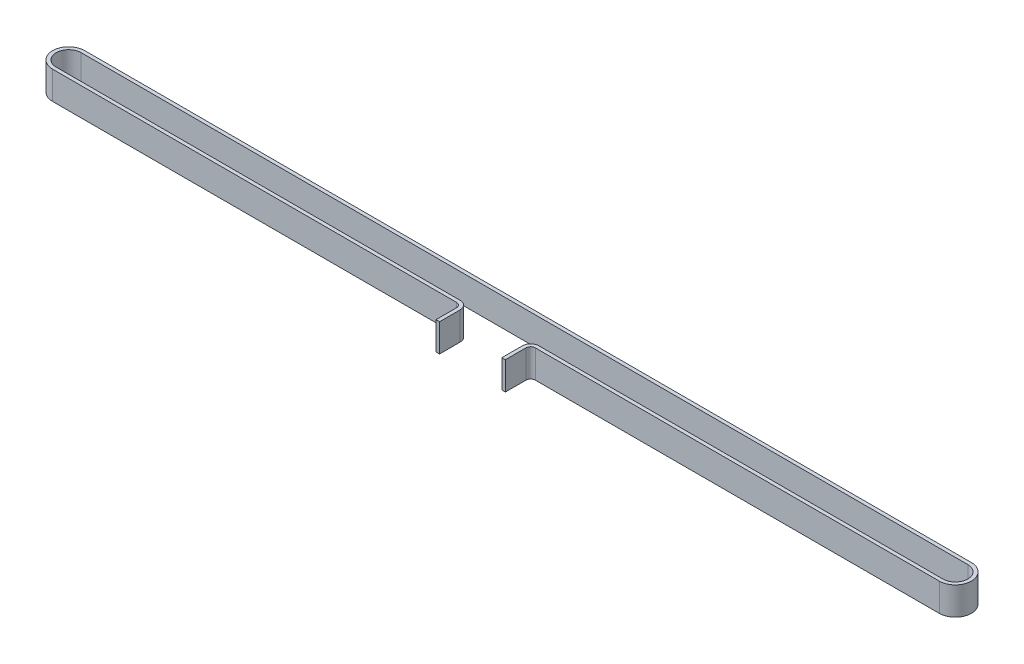
ISO-10303-21;
HEADER;
FILE_DESCRIPTION(('STEP AP214'),'2;1');
FILE_NAME('part.step','',(''),(''),'','','');
FILE_SCHEMA(('AUTOMOTIVE_DESIGN { 1 0 10303 214 1 1 1 1 }'));
ENDSEC;
DATA;
#1=APPLICATION_CONTEXT('core data for automotive mechanical design processes');
#2=APPLICATION_PROTOCOL_DEFINITION('international standard','automotive_design',2000,#1);
#3=PRODUCT_CONTEXT('',#1,'mechanical');
#4=PRODUCT('Part','Part','',(#3));
#5=PRODUCT_RELATED_PRODUCT_CATEGORY('part','',(#4));
#6=PRODUCT_DEFINITION_FORMATION('','',#4);
#7=PRODUCT_DEFINITION_CONTEXT('part definition',#1,'design');
#8=PRODUCT_DEFINITION('design','',#6,#7);
#9=PRODUCT_DEFINITION_SHAPE('','',#8);
#10=(LENGTH_UNIT() NAMED_UNIT(*) SI_UNIT(.MILLI.,.METRE.));
#11=(NAMED_UNIT(*) PLANE_ANGLE_UNIT() SI_UNIT($,.RADIAN.));
#12=(NAMED_UNIT(*) SI_UNIT($,.STERADIAN.) SOLID_ANGLE_UNIT());
#13=UNCERTAINTY_MEASURE_WITH_UNIT(LENGTH_MEASURE(1.E-05),#10,'distance_accuracy_value','');
#14=(GEOMETRIC_REPRESENTATION_CONTEXT(3) GLOBAL_UNCERTAINTY_ASSIGNED_CONTEXT((#13)) GLOBAL_UNIT_ASSIGNED_CONTEXT((#10,
#11,#12)) REPRESENTATION_CONTEXT('',''));
#15=CARTESIAN_POINT('',(0.,0.,0.));
#16=DIRECTION('',(0.,0.,1.));
#17=DIRECTION('',(1.,0.,0.));
#18=AXIS2_PLACEMENT_3D('',#15,#16,#17);
#19=CARTESIAN_POINT('',(203.352965498256,12.,8.881));
#20=DIRECTION('',(1.,0.,0.));
#21=DIRECTION('',(0.,0.,-1.));
#22=AXIS2_PLACEMENT_3D('',#19,#20,#21);
#23=PLANE('',#22);
#24=DIRECTION('',(0.,0.,-1.));
#25=VECTOR('',#24,1.);
#26=CARTESIAN_POINT('',(203.352965498256,0.,8.881));
#27=LINE('',#26,#25);
#28=CARTESIAN_POINT('',(203.352965498256,0.,8.881));
#29=VERTEX_POINT('',#28);
#30=CARTESIAN_POINT('',(203.352965498256,0.,17.7005415216234));
#31=VERTEX_POINT('',#30);
#32=EDGE_CURVE('E206',#29,#31,#27,.F.);
#33=ORIENTED_EDGE('',*,*,#32,.T.);
#34=DIRECTION('',(0.,-1.,0.));
#35=VECTOR('',#34,1.);
#36=CARTESIAN_POINT('',(203.352965498256,12.,17.7005415216234));
#37=LINE('',#36,#35);
#38=CARTESIAN_POINT('',(203.352965498256,12.,17.7005415216234));
#39=VERTEX_POINT('',#38);
#40=EDGE_CURVE('E11',#39,#31,#37,.T.);
#41=ORIENTED_EDGE('',*,*,#40,.F.);
#42=DIRECTION('',(0.,0.,-1.));
#43=VECTOR('',#42,1.);
#44=CARTESIAN_POINT('',(203.352965498256,12.,8.881));
#45=LINE('',#44,#43);
#46=CARTESIAN_POINT('',(203.352965498256,12.,8.881));
#47=VERTEX_POINT('',#46);
#48=EDGE_CURVE('E131',#47,#39,#45,.F.);
#49=ORIENTED_EDGE('',*,*,#48,.F.);
#50=DIRECTION('',(0.,-1.,0.));
#51=VECTOR('',#50,1.);
#52=CARTESIAN_POINT('',(203.352965498256,12.,8.881));
#53=LINE('',#52,#51);
#54=EDGE_CURVE('E202',#47,#29,#53,.T.);
#55=ORIENTED_EDGE('',*,*,#54,.T.);
#56=EDGE_LOOP('',(#33,#41,#49,#55));
#57=FACE_BOUND('',#56,.T.);
#58=ADVANCED_FACE('F39',(#57),#23,.F.);
#59=CARTESIAN_POINT('',(204.872965498256,12.,17.7005415216234));
#60=DIRECTION('',(0.,0.,1.));
#61=DIRECTION('',(1.,0.,0.));
#62=AXIS2_PLACEMENT_3D('',#59,#60,#61);
#63=PLANE('',#62);
#64=DIRECTION('',(-1.,0.,0.));
#65=VECTOR('',#64,1.);
#66=CARTESIAN_POINT('',(204.872965498256,0.,17.7005415216234));
#67=LINE('',#66,#65);
#68=CARTESIAN_POINT('',(204.872965498256,0.,17.7005415216234));
#69=VERTEX_POINT('',#68);
#70=EDGE_CURVE('E209',#69,#31,#67,.T.);
#71=ORIENTED_EDGE('',*,*,#70,.F.);
#72=DIRECTION('',(0.,-1.,0.));
#73=VECTOR('',#72,1.);
#74=CARTESIAN_POINT('',(204.872965498256,12.,17.7005415216234));
#75=LINE('',#74,#73);
#76=CARTESIAN_POINT('',(204.872965498256,12.,17.7005415216234));
#77=VERTEX_POINT('',#76);
#78=EDGE_CURVE('E47',#77,#69,#75,.T.);
#79=ORIENTED_EDGE('',*,*,#78,.F.);
#80=DIRECTION('',(-1.,0.,0.));
#81=VECTOR('',#80,1.);
#82=CARTESIAN_POINT('',(204.872965498256,12.,17.7005415216234));
#83=LINE('',#82,#81);
#84=EDGE_CURVE('E311',#77,#39,#83,.T.);
#85=ORIENTED_EDGE('',*,*,#84,.T.);
#86=ORIENTED_EDGE('',*,*,#40,.T.);
#87=EDGE_LOOP('',(#71,#79,#85,#86));
#88=FACE_BOUND('',#87,.T.);
#89=ADVANCED_FACE('F298',(#88),#63,.T.);
#90=CARTESIAN_POINT('',(204.872965498256,12.,8.881));
#91=DIRECTION('',(1.,0.,0.));
#92=DIRECTION('',(0.,0.,-1.));
#93=AXIS2_PLACEMENT_3D('',#90,#91,#92);
#94=PLANE('',#93);
#95=DIRECTION('',(0.,0.,-1.));
#96=VECTOR('',#95,1.);
#97=CARTESIAN_POINT('',(204.872965498256,0.,8.881));
#98=LINE('',#97,#96);
#99=CARTESIAN_POINT('',(204.872965498256,0.,8.881));
#100=VERTEX_POINT('',#99);
#101=EDGE_CURVE('E212',#100,#69,#98,.F.);
#102=ORIENTED_EDGE('',*,*,#101,.F.);
#103=DIRECTION('',(0.,-1.,0.));
#104=VECTOR('',#103,1.);
#105=CARTESIAN_POINT('',(204.872965498256,12.,8.881));
#106=LINE('',#105,#104);
#107=CARTESIAN_POINT('',(204.872965498256,12.,8.881));
#108=VERTEX_POINT('',#107);
#109=EDGE_CURVE('E288',#108,#100,#106,.T.);
#110=ORIENTED_EDGE('',*,*,#109,.F.);
#111=DIRECTION('',(0.,0.,-1.));
#112=VECTOR('',#111,1.);
#113=CARTESIAN_POINT('',(204.872965498256,12.,8.881));
#114=LINE('',#113,#112);
#115=EDGE_CURVE('E295',#108,#77,#114,.F.);
#116=ORIENTED_EDGE('',*,*,#115,.T.);
#117=ORIENTED_EDGE('',*,*,#78,.T.);
#118=EDGE_LOOP('',(#102,#110,#116,#117));
#119=FACE_BOUND('',#118,.T.);
#120=ADVANCED_FACE('F293',(#119),#94,.T.);
#121=CARTESIAN_POINT('',(206.872965498256,12.,8.88100000000002));
#122=DIRECTION('',(0.,-1.,0.));
#123=DIRECTION('',(0.,0.,-1.));
#124=AXIS2_PLACEMENT_3D('',#121,#122,#123);
#125=CYLINDRICAL_SURFACE('',#124,2.00000000000001);
#126=CARTESIAN_POINT('',(206.872965498256,0.,8.88100000000002));
#127=DIRECTION('',(0.,1.,0.));
#128=DIRECTION('',(1.,0.,0.));
#129=AXIS2_PLACEMENT_3D('',#126,#127,#128);
#130=CIRCLE('',#129,2.00000000000001);
#131=CARTESIAN_POINT('',(206.872965498256,0.,6.88100000000001));
#132=VERTEX_POINT('',#131);
#133=EDGE_CURVE('E215',#132,#100,#130,.T.);
#134=ORIENTED_EDGE('',*,*,#133,.F.);
#135=DIRECTION('',(0.,-1.,0.));
#136=VECTOR('',#135,1.);
#137=CARTESIAN_POINT('',(206.872965498256,12.,6.88100000000001));
#138=LINE('',#137,#136);
#139=CARTESIAN_POINT('',(206.872965498256,12.,6.88100000000001));
#140=VERTEX_POINT('',#139);
#141=EDGE_CURVE('E286',#140,#132,#138,.T.);
#142=ORIENTED_EDGE('',*,*,#141,.F.);
#143=CARTESIAN_POINT('',(206.872965498256,12.,8.88100000000002));
#144=DIRECTION('',(0.,1.,0.));
#145=DIRECTION('',(1.,0.,0.));
#146=AXIS2_PLACEMENT_3D('',#143,#144,#145);
#147=CIRCLE('',#146,2.00000000000001);
#148=EDGE_CURVE('E308',#140,#108,#147,.T.);
#149=ORIENTED_EDGE('',*,*,#148,.T.);
#150=ORIENTED_EDGE('',*,*,#109,.T.);
#151=EDGE_LOOP('',(#134,#142,#149,#150));
#152=FACE_BOUND('',#151,.T.);
#153=ADVANCED_FACE('F305',(#152),#125,.F.);
#154=CARTESIAN_POINT('',(380.,12.,6.881));
#155=DIRECTION('',(0.,0.,1.));
#156=DIRECTION('',(1.,0.,0.));
#157=AXIS2_PLACEMENT_3D('',#154,#155,#156);
#158=PLANE('',#157);
#159=DIRECTION('',(-1.,0.,0.));
#160=VECTOR('',#159,1.);
#161=CARTESIAN_POINT('',(380.,0.,6.881));
#162=LINE('',#161,#160);
#163=CARTESIAN_POINT('',(380.,0.,6.881));
#164=VERTEX_POINT('',#163);
#165=EDGE_CURVE('E218',#164,#132,#162,.T.);
#166=ORIENTED_EDGE('',*,*,#165,.F.);
#167=DIRECTION('',(0.,-1.,0.));
#168=VECTOR('',#167,1.);
#169=CARTESIAN_POINT('',(380.,12.,6.881));
#170=LINE('',#169,#168);
#171=CARTESIAN_POINT('',(380.,12.,6.881));
#172=VERTEX_POINT('',#171);
#173=EDGE_CURVE('E284',#172,#164,#170,.T.);
#174=ORIENTED_EDGE('',*,*,#173,.F.);
#175=DIRECTION('',(-1.,0.,0.));
#176=VECTOR('',#175,1.);
#177=CARTESIAN_POINT('',(380.,12.,6.881));
#178=LINE('',#177,#176);
#179=EDGE_CURVE('E313',#172,#140,#178,.T.);
#180=ORIENTED_EDGE('',*,*,#179,.T.);
#181=ORIENTED_EDGE('',*,*,#141,.T.);
#182=EDGE_LOOP('',(#166,#174,#180,#181));
#183=FACE_BOUND('',#182,.T.);
#184=ADVANCED_FACE('F379',(#183),#158,.T.);
#185=CARTESIAN_POINT('',(380.,12.,0.));
#186=DIRECTION('',(0.,-1.,0.));
#187=DIRECTION('',(0.,0.,-1.));
#188=AXIS2_PLACEMENT_3D('',#185,#186,#187);
#189=CYLINDRICAL_SURFACE('',#188,6.881);
#190=CARTESIAN_POINT('',(380.,0.,0.));
#191=DIRECTION('',(0.,1.,0.));
#192=DIRECTION('',(1.,0.,0.));
#193=AXIS2_PLACEMENT_3D('',#190,#191,#192);
#194=CIRCLE('',#193,6.881);
#195=CARTESIAN_POINT('',(380.,0.,-6.881));
#196=VERTEX_POINT('',#195);
#197=EDGE_CURVE('E221',#196,#164,#194,.F.);
#198=ORIENTED_EDGE('',*,*,#197,.F.);
#199=DIRECTION('',(0.,-1.,0.));
#200=VECTOR('',#199,1.);
#201=CARTESIAN_POINT('',(380.,12.,-6.881));
#202=LINE('',#201,#200);
#203=CARTESIAN_POINT('',(380.,12.,-6.881));
#204=VERTEX_POINT('',#203);
#205=EDGE_CURVE('E282',#204,#196,#202,.T.);
#206=ORIENTED_EDGE('',*,*,#205,.F.);
#207=CARTESIAN_POINT('',(380.,12.,0.));
#208=DIRECTION('',(0.,1.,0.));
#209=DIRECTION('',(1.,0.,0.));
#210=AXIS2_PLACEMENT_3D('',#207,#208,#209);
#211=CIRCLE('',#210,6.881);
#212=EDGE_CURVE('E319',#204,#172,#211,.F.);
#213=ORIENTED_EDGE('',*,*,#212,.T.);
#214=ORIENTED_EDGE('',*,*,#173,.T.);
#215=EDGE_LOOP('',(#198,#206,#213,#214));
#216=FACE_BOUND('',#215,.T.);
#217=ADVANCED_FACE('F382',(#216),#189,.T.);
#218=CARTESIAN_POINT('',(0.,12.,-6.881));
#219=DIRECTION('',(0.,0.,-1.));
#220=DIRECTION('',(-1.,0.,0.));
#221=AXIS2_PLACEMENT_3D('',#218,#219,#220);
#222=PLANE('',#221);
#223=DIRECTION('',(1.,0.,0.));
#224=VECTOR('',#223,1.);
#225=CARTESIAN_POINT('',(0.,0.,-6.881));
#226=LINE('',#225,#224);
#227=CARTESIAN_POINT('',(0.,0.,-6.881));
#228=VERTEX_POINT('',#227);
#229=EDGE_CURVE('E224',#228,#196,#226,.T.);
#230=ORIENTED_EDGE('',*,*,#229,.F.);
#231=DIRECTION('',(0.,-1.,0.));
#232=VECTOR('',#231,1.);
#233=CARTESIAN_POINT('',(0.,12.,-6.881));
#234=LINE('',#233,#232);
#235=CARTESIAN_POINT('',(0.,12.,-6.881));
#236=VERTEX_POINT('',#235);
#237=EDGE_CURVE('E280',#236,#228,#234,.T.);
#238=ORIENTED_EDGE('',*,*,#237,.F.);
#239=DIRECTION('',(1.,0.,0.));
#240=VECTOR('',#239,1.);
#241=CARTESIAN_POINT('',(0.,12.,-6.881));
#242=LINE('',#241,#240);
#243=EDGE_CURVE('E322',#236,#204,#242,.T.);
#244=ORIENTED_EDGE('',*,*,#243,.T.);
#245=ORIENTED_EDGE('',*,*,#205,.T.);
#246=EDGE_LOOP('',(#230,#238,#244,#245));
#247=FACE_BOUND('',#246,.T.);
#248=ADVANCED_FACE('F386',(#247),#222,.T.);
#249=CARTESIAN_POINT('',(0.,12.,0.));
#250=DIRECTION('',(0.,-1.,0.));
#251=DIRECTION('',(0.,0.,-1.));
#252=AXIS2_PLACEMENT_3D('',#249,#250,#251);
#253=CYLINDRICAL_SURFACE('',#252,6.881);
#254=CARTESIAN_POINT('',(0.,0.,0.));
#255=DIRECTION('',(0.,1.,0.));
#256=DIRECTION('',(1.,0.,0.));
#257=AXIS2_PLACEMENT_3D('',#254,#255,#256);
#258=CIRCLE('',#257,6.881);
#259=CARTESIAN_POINT('',(0.,0.,6.881));
#260=VERTEX_POINT('',#259);
#261=EDGE_CURVE('E227',#260,#228,#258,.F.);
#262=ORIENTED_EDGE('',*,*,#261,.F.);
#263=DIRECTION('',(0.,-1.,0.));
#264=VECTOR('',#263,1.);
#265=CARTESIAN_POINT('',(0.,12.,6.881));
#266=LINE('',#265,#264);
#267=CARTESIAN_POINT('',(0.,12.,6.881));
#268=VERTEX_POINT('',#267);
#269=EDGE_CURVE('E278',#268,#260,#266,.T.);
#270=ORIENTED_EDGE('',*,*,#269,.F.);
#271=CARTESIAN_POINT('',(0.,12.,0.));
#272=DIRECTION('',(0.,1.,0.));
#273=DIRECTION('',(1.,0.,0.));
#274=AXIS2_PLACEMENT_3D('',#271,#272,#273);
#275=CIRCLE('',#274,6.881);
#276=EDGE_CURVE('E325',#268,#236,#275,.F.);
#277=ORIENTED_EDGE('',*,*,#276,.T.);
#278=ORIENTED_EDGE('',*,*,#237,.T.);
#279=EDGE_LOOP('',(#262,#270,#277,#278));
#280=FACE_BOUND('',#279,.T.);
#281=ADVANCED_FACE('F390',(#280),#253,.T.);
#282=CARTESIAN_POINT('',(0.,12.,6.881));
#283=DIRECTION('',(0.,0.,1.));
#284=DIRECTION('',(1.,0.,0.));
#285=AXIS2_PLACEMENT_3D('',#282,#283,#284);
#286=PLANE('',#285);
#287=DIRECTION('',(1.,0.,0.));
#288=VECTOR('',#287,1.);
#289=CARTESIAN_POINT('',(0.,0.,6.881));
#290=LINE('',#289,#288);
#291=CARTESIAN_POINT('',(173.127034501744,0.,6.881));
#292=VERTEX_POINT('',#291);
#293=EDGE_CURVE('E230',#292,#260,#290,.F.);
#294=ORIENTED_EDGE('',*,*,#293,.F.);
#295=DIRECTION('',(0.,-1.,0.));
#296=VECTOR('',#295,1.);
#297=CARTESIAN_POINT('',(173.127034501744,12.,6.881));
#298=LINE('',#297,#296);
#299=CARTESIAN_POINT('',(173.127034501744,12.,6.881));
#300=VERTEX_POINT('',#299);
#301=EDGE_CURVE('E276',#300,#292,#298,.T.);
#302=ORIENTED_EDGE('',*,*,#301,.F.);
#303=DIRECTION('',(1.,0.,0.));
#304=VECTOR('',#303,1.);
#305=CARTESIAN_POINT('',(0.,12.,6.881));
#306=LINE('',#305,#304);
#307=EDGE_CURVE('E328',#300,#268,#306,.F.);
#308=ORIENTED_EDGE('',*,*,#307,.T.);
#309=ORIENTED_EDGE('',*,*,#269,.T.);
#310=EDGE_LOOP('',(#294,#302,#308,#309));
#311=FACE_BOUND('',#310,.T.);
#312=ADVANCED_FACE('F394',(#311),#286,.T.);
#313=CARTESIAN_POINT('',(173.127034501744,12.,8.881));
#314=DIRECTION('',(0.,-1.,0.));
#315=DIRECTION('',(0.,0.,-1.));
#316=AXIS2_PLACEMENT_3D('',#313,#314,#315);
#317=CYLINDRICAL_SURFACE('',#316,2.);
#318=CARTESIAN_POINT('',(173.127034501744,0.,8.881));
#319=DIRECTION('',(0.,1.,0.));
#320=DIRECTION('',(1.,0.,0.));
#321=AXIS2_PLACEMENT_3D('',#318,#319,#320);
#322=CIRCLE('',#321,2.);
#323=CARTESIAN_POINT('',(175.127034501744,0.,8.881));
#324=VERTEX_POINT('',#323);
#325=EDGE_CURVE('E233',#324,#292,#322,.T.);
#326=ORIENTED_EDGE('',*,*,#325,.F.);
#327=DIRECTION('',(0.,-1.,0.));
#328=VECTOR('',#327,1.);
#329=CARTESIAN_POINT('',(175.127034501744,12.,8.881));
#330=LINE('',#329,#328);
#331=CARTESIAN_POINT('',(175.127034501744,12.,8.881));
#332=VERTEX_POINT('',#331);
#333=EDGE_CURVE('E274',#332,#324,#330,.T.);
#334=ORIENTED_EDGE('',*,*,#333,.F.);
#335=CARTESIAN_POINT('',(173.127034501744,12.,8.881));
#336=DIRECTION('',(0.,1.,0.));
#337=DIRECTION('',(1.,0.,0.));
#338=AXIS2_PLACEMENT_3D('',#335,#336,#337);
#339=CIRCLE('',#338,2.);
#340=EDGE_CURVE('E331',#332,#300,#339,.T.);
#341=ORIENTED_EDGE('',*,*,#340,.T.);
#342=ORIENTED_EDGE('',*,*,#301,.T.);
#343=EDGE_LOOP('',(#326,#334,#341,#342));
#344=FACE_BOUND('',#343,.T.);
#345=ADVANCED_FACE('F398',(#344),#317,.F.);
#346=CARTESIAN_POINT('',(175.127034501744,12.,8.881));
#347=DIRECTION('',(-1.,0.,0.));
#348=DIRECTION('',(0.,0.,1.));
#349=AXIS2_PLACEMENT_3D('',#346,#347,#348);
#350=PLANE('',#349);
#351=DIRECTION('',(0.,0.,-1.));
#352=VECTOR('',#351,1.);
#353=CARTESIAN_POINT('',(175.127034501744,0.,8.881));
#354=LINE('',#353,#352);
#355=CARTESIAN_POINT('',(175.127034501744,0.,17.7005415216234));
#356=VERTEX_POINT('',#355);
#357=EDGE_CURVE('E236',#356,#324,#354,.T.);
#358=ORIENTED_EDGE('',*,*,#357,.F.);
#359=DIRECTION('',(0.,-1.,0.));
#360=VECTOR('',#359,1.);
#361=CARTESIAN_POINT('',(175.127034501744,12.,17.7005415216234));
#362=LINE('',#361,#360);
#363=CARTESIAN_POINT('',(175.127034501744,12.,17.7005415216234));
#364=VERTEX_POINT('',#363);
#365=EDGE_CURVE('E272',#364,#356,#362,.T.);
#366=ORIENTED_EDGE('',*,*,#365,.F.);
#367=DIRECTION('',(0.,0.,-1.));
#368=VECTOR('',#367,1.);
#369=CARTESIAN_POINT('',(175.127034501744,12.,8.881));
#370=LINE('',#369,#368);
#371=EDGE_CURVE('E334',#364,#332,#370,.T.);
#372=ORIENTED_EDGE('',*,*,#371,.T.);
#373=ORIENTED_EDGE('',*,*,#333,.T.);
#374=EDGE_LOOP('',(#358,#366,#372,#373));
#375=FACE_BOUND('',#374,.T.);
#376=ADVANCED_FACE('F402',(#375),#350,.T.);
#377=CARTESIAN_POINT('',(176.647034501744,12.,17.7005415216234));
#378=DIRECTION('',(0.,0.,1.));
#379=DIRECTION('',(1.,0.,0.));
#380=AXIS2_PLACEMENT_3D('',#377,#378,#379);
#381=PLANE('',#380);
#382=DIRECTION('',(-1.,0.,0.));
#383=VECTOR('',#382,1.);
#384=CARTESIAN_POINT('',(176.647034501744,0.,17.7005415216234));
#385=LINE('',#384,#383);
#386=CARTESIAN_POINT('',(176.647034501744,0.,17.7005415216234));
#387=VERTEX_POINT('',#386);
#388=EDGE_CURVE('E239',#387,#356,#385,.T.);
#389=ORIENTED_EDGE('',*,*,#388,.F.);
#390=DIRECTION('',(0.,-1.,0.));
#391=VECTOR('',#390,1.);
#392=CARTESIAN_POINT('',(176.647034501744,12.,17.7005415216234));
#393=LINE('',#392,#391);
#394=CARTESIAN_POINT('',(176.647034501744,12.,17.7005415216234));
#395=VERTEX_POINT('',#394);
#396=EDGE_CURVE('E270',#395,#387,#393,.T.);
#397=ORIENTED_EDGE('',*,*,#396,.F.);
#398=DIRECTION('',(-1.,0.,0.));
#399=VECTOR('',#398,1.);
#400=CARTESIAN_POINT('',(176.647034501744,12.,17.7005415216234));
#401=LINE('',#400,#399);
#402=EDGE_CURVE('E337',#395,#364,#401,.T.);
#403=ORIENTED_EDGE('',*,*,#402,.T.);
#404=ORIENTED_EDGE('',*,*,#365,.T.);
#405=EDGE_LOOP('',(#389,#397,#403,#404));
#406=FACE_BOUND('',#405,.T.);
#407=ADVANCED_FACE('F406',(#406),#381,.T.);
#408=CARTESIAN_POINT('',(176.647034501744,12.,8.881));
#409=DIRECTION('',(-1.,0.,0.));
#410=DIRECTION('',(0.,0.,1.));
#411=AXIS2_PLACEMENT_3D('',#408,#409,#410);
#412=PLANE('',#411);
#413=DIRECTION('',(0.,0.,-1.));
#414=VECTOR('',#413,1.);
#415=CARTESIAN_POINT('',(176.647034501744,0.,8.881));
#416=LINE('',#415,#414);
#417=CARTESIAN_POINT('',(176.647034501744,0.,8.881));
#418=VERTEX_POINT('',#417);
#419=EDGE_CURVE('E242',#387,#418,#416,.T.);
#420=ORIENTED_EDGE('',*,*,#419,.T.);
#421=DIRECTION('',(0.,-1.,0.));
#422=VECTOR('',#421,1.);
#423=CARTESIAN_POINT('',(176.647034501744,12.,8.881));
#424=LINE('',#423,#422);
#425=CARTESIAN_POINT('',(176.647034501744,12.,8.881));
#426=VERTEX_POINT('',#425);
#427=EDGE_CURVE('E267',#426,#418,#424,.T.);
#428=ORIENTED_EDGE('',*,*,#427,.F.);
#429=DIRECTION('',(0.,0.,-1.));
#430=VECTOR('',#429,1.);
#431=CARTESIAN_POINT('',(176.647034501744,12.,8.881));
#432=LINE('',#431,#430);
#433=EDGE_CURVE('E340',#395,#426,#432,.T.);
#434=ORIENTED_EDGE('',*,*,#433,.F.);
#435=ORIENTED_EDGE('',*,*,#396,.T.);
#436=EDGE_LOOP('',(#420,#428,#434,#435));
#437=FACE_BOUND('',#436,.T.);
#438=ADVANCED_FACE('F410',(#437),#412,.F.);
#439=CARTESIAN_POINT('',(173.127034501744,12.,8.881));
#440=DIRECTION('',(0.,-1.,0.));
#441=DIRECTION('',(0.,0.,-1.));
#442=AXIS2_PLACEMENT_3D('',#439,#440,#441);
#443=CYLINDRICAL_SURFACE('',#442,3.52);
#444=CARTESIAN_POINT('',(173.127034501744,0.,8.881));
#445=DIRECTION('',(0.,1.,0.));
#446=DIRECTION('',(1.,0.,0.));
#447=AXIS2_PLACEMENT_3D('',#444,#445,#446);
#448=CIRCLE('',#447,3.52);
#449=CARTESIAN_POINT('',(173.127034501744,0.,5.361));
#450=VERTEX_POINT('',#449);
#451=EDGE_CURVE('E244',#418,#450,#448,.T.);
#452=ORIENTED_EDGE('',*,*,#451,.T.);
#453=DIRECTION('',(0.,-1.,0.));
#454=VECTOR('',#453,1.);
#455=CARTESIAN_POINT('',(173.127034501744,12.,5.361));
#456=LINE('',#455,#454);
#457=CARTESIAN_POINT('',(173.127034501744,12.,5.361));
#458=VERTEX_POINT('',#457);
#459=EDGE_CURVE('E264',#458,#450,#456,.T.);
#460=ORIENTED_EDGE('',*,*,#459,.F.);
#461=CARTESIAN_POINT('',(173.127034501744,12.,8.881));
#462=DIRECTION('',(0.,1.,0.));
#463=DIRECTION('',(1.,0.,0.));
#464=AXIS2_PLACEMENT_3D('',#461,#462,#463);
#465=CIRCLE('',#464,3.52);
#466=EDGE_CURVE('E342',#426,#458,#465,.T.);
#467=ORIENTED_EDGE('',*,*,#466,.F.);
#468=ORIENTED_EDGE('',*,*,#427,.T.);
#469=EDGE_LOOP('',(#452,#460,#467,#468));
#470=FACE_BOUND('',#469,.T.);
#471=ADVANCED_FACE('F414',(#470),#443,.T.);
#472=CARTESIAN_POINT('',(0.,12.,5.361));
#473=DIRECTION('',(0.,0.,1.));
#474=DIRECTION('',(1.,0.,0.));
#475=AXIS2_PLACEMENT_3D('',#472,#473,#474);
#476=PLANE('',#475);
#477=DIRECTION('',(1.,0.,0.));
#478=VECTOR('',#477,1.);
#479=CARTESIAN_POINT('',(0.,0.,5.361));
#480=LINE('',#479,#478);
#481=CARTESIAN_POINT('',(0.,0.,5.361));
#482=VERTEX_POINT('',#481);
#483=EDGE_CURVE('E246',#450,#482,#480,.F.);
#484=ORIENTED_EDGE('',*,*,#483,.T.);
#485=DIRECTION('',(0.,-1.,0.));
#486=VECTOR('',#485,1.);
#487=CARTESIAN_POINT('',(0.,12.,5.361));
#488=LINE('',#487,#486);
#489=CARTESIAN_POINT('',(0.,12.,5.361));
#490=VERTEX_POINT('',#489);
#491=EDGE_CURVE('E261',#490,#482,#488,.T.);
#492=ORIENTED_EDGE('',*,*,#491,.F.);
#493=DIRECTION('',(1.,0.,0.));
#494=VECTOR('',#493,1.);
#495=CARTESIAN_POINT('',(0.,12.,5.361));
#496=LINE('',#495,#494);
#497=EDGE_CURVE('E344',#458,#490,#496,.F.);
#498=ORIENTED_EDGE('',*,*,#497,.F.);
#499=ORIENTED_EDGE('',*,*,#459,.T.);
#500=EDGE_LOOP('',(#484,#492,#498,#499));
#501=FACE_BOUND('',#500,.T.);
#502=ADVANCED_FACE('F418',(#501),#476,.F.);
#503=CARTESIAN_POINT('',(0.,12.,0.));
#504=DIRECTION('',(0.,-1.,0.));
#505=DIRECTION('',(0.,0.,-1.));
#506=AXIS2_PLACEMENT_3D('',#503,#504,#505);
#507=CYLINDRICAL_SURFACE('',#506,5.361);
#508=CARTESIAN_POINT('',(0.,0.,0.));
#509=DIRECTION('',(0.,1.,0.));
#510=DIRECTION('',(1.,0.,0.));
#511=AXIS2_PLACEMENT_3D('',#508,#509,#510);
#512=CIRCLE('',#511,5.361);
#513=CARTESIAN_POINT('',(0.,0.,-5.361));
#514=VERTEX_POINT('',#513);
#515=EDGE_CURVE('E248',#482,#514,#512,.F.);
#516=ORIENTED_EDGE('',*,*,#515,.T.);
#517=DIRECTION('',(0.,-1.,0.));
#518=VECTOR('',#517,1.);
#519=CARTESIAN_POINT('',(0.,12.,-5.361));
#520=LINE('',#519,#518);
#521=CARTESIAN_POINT('',(0.,12.,-5.361));
#522=VERTEX_POINT('',#521);
#523=EDGE_CURVE('E258',#522,#514,#520,.T.);
#524=ORIENTED_EDGE('',*,*,#523,.F.);
#525=CARTESIAN_POINT('',(0.,12.,0.));
#526=DIRECTION('',(0.,1.,0.));
#527=DIRECTION('',(1.,0.,0.));
#528=AXIS2_PLACEMENT_3D('',#525,#526,#527);
#529=CIRCLE('',#528,5.361);
#530=EDGE_CURVE('E346',#490,#522,#529,.F.);
#531=ORIENTED_EDGE('',*,*,#530,.F.);
#532=ORIENTED_EDGE('',*,*,#491,.T.);
#533=EDGE_LOOP('',(#516,#524,#531,#532));
#534=FACE_BOUND('',#533,.T.);
#535=ADVANCED_FACE('F352',(#534),#507,.F.);
#536=CARTESIAN_POINT('',(0.,12.,-5.361));
#537=DIRECTION('',(0.,0.,-1.));
#538=DIRECTION('',(-1.,0.,0.));
#539=AXIS2_PLACEMENT_3D('',#536,#537,#538);
#540=PLANE('',#539);
#541=DIRECTION('',(1.,0.,0.));
#542=VECTOR('',#541,1.);
#543=CARTESIAN_POINT('',(0.,0.,-5.361));
#544=LINE('',#543,#542);
#545=CARTESIAN_POINT('',(380.,0.,-5.361));
#546=VERTEX_POINT('',#545);
#547=EDGE_CURVE('E250',#514,#546,#544,.T.);
#548=ORIENTED_EDGE('',*,*,#547,.T.);
#549=DIRECTION('',(0.,-1.,0.));
#550=VECTOR('',#549,1.);
#551=CARTESIAN_POINT('',(380.,12.,-5.361));
#552=LINE('',#551,#550);
#553=CARTESIAN_POINT('',(380.,12.,-5.361));
#554=VERTEX_POINT('',#553);
#555=EDGE_CURVE('E197',#554,#546,#552,.T.);
#556=ORIENTED_EDGE('',*,*,#555,.F.);
#557=DIRECTION('',(1.,0.,0.));
#558=VECTOR('',#557,1.);
#559=CARTESIAN_POINT('',(0.,12.,-5.361));
#560=LINE('',#559,#558);
#561=EDGE_CURVE('E188',#522,#554,#560,.T.);
#562=ORIENTED_EDGE('',*,*,#561,.F.);
#563=ORIENTED_EDGE('',*,*,#523,.T.);
#564=EDGE_LOOP('',(#548,#556,#562,#563));
#565=FACE_BOUND('',#564,.T.);
#566=ADVANCED_FACE('F356',(#565),#540,.F.);
#567=CARTESIAN_POINT('',(380.,12.,0.));
#568=DIRECTION('',(0.,-1.,0.));
#569=DIRECTION('',(0.,0.,-1.));
#570=AXIS2_PLACEMENT_3D('',#567,#568,#569);
#571=CYLINDRICAL_SURFACE('',#570,5.361);
#572=CARTESIAN_POINT('',(380.,0.,0.));
#573=DIRECTION('',(0.,1.,0.));
#574=DIRECTION('',(1.,0.,0.));
#575=AXIS2_PLACEMENT_3D('',#572,#573,#574);
#576=CIRCLE('',#575,5.361);
#577=CARTESIAN_POINT('',(380.,0.,5.361));
#578=VERTEX_POINT('',#577);
#579=EDGE_CURVE('E196',#546,#578,#576,.F.);
#580=ORIENTED_EDGE('',*,*,#579,.T.);
#581=DIRECTION('',(0.,-1.,0.));
#582=VECTOR('',#581,1.);
#583=CARTESIAN_POINT('',(380.,12.,5.361));
#584=LINE('',#583,#582);
#585=CARTESIAN_POINT('',(380.,12.,5.361));
#586=VERTEX_POINT('',#585);
#587=EDGE_CURVE('E193',#586,#578,#584,.T.);
#588=ORIENTED_EDGE('',*,*,#587,.F.);
#589=CARTESIAN_POINT('',(380.,12.,0.));
#590=DIRECTION('',(0.,1.,0.));
#591=DIRECTION('',(1.,0.,0.));
#592=AXIS2_PLACEMENT_3D('',#589,#590,#591);
#593=CIRCLE('',#592,5.361);
#594=EDGE_CURVE('E182',#554,#586,#593,.F.);
#595=ORIENTED_EDGE('',*,*,#594,.F.);
#596=ORIENTED_EDGE('',*,*,#555,.T.);
#597=EDGE_LOOP('',(#580,#588,#595,#596));
#598=FACE_BOUND('',#597,.T.);
#599=ADVANCED_FACE('F194',(#598),#571,.F.);
#600=CARTESIAN_POINT('',(380.,12.,5.361));
#601=DIRECTION('',(0.,0.,1.));
#602=DIRECTION('',(1.,0.,0.));
#603=AXIS2_PLACEMENT_3D('',#600,#601,#602);
#604=PLANE('',#603);
#605=DIRECTION('',(-1.,0.,0.));
#606=VECTOR('',#605,1.);
#607=CARTESIAN_POINT('',(380.,0.,5.361));
#608=LINE('',#607,#606);
#609=CARTESIAN_POINT('',(206.872965498256,0.,5.36100000000001));
#610=VERTEX_POINT('',#609);
#611=EDGE_CURVE('E119',#578,#610,#608,.T.);
#612=ORIENTED_EDGE('',*,*,#611,.T.);
#613=DIRECTION('',(0.,-1.,0.));
#614=VECTOR('',#613,1.);
#615=CARTESIAN_POINT('',(206.872965498256,12.,5.36100000000001));
#616=LINE('',#615,#614);
#617=CARTESIAN_POINT('',(206.872965498256,12.,5.36100000000001));
#618=VERTEX_POINT('',#617);
#619=EDGE_CURVE('E198',#618,#610,#616,.T.);
#620=ORIENTED_EDGE('',*,*,#619,.F.);
#621=DIRECTION('',(-1.,0.,0.));
#622=VECTOR('',#621,1.);
#623=CARTESIAN_POINT('',(380.,12.,5.361));
#624=LINE('',#623,#622);
#625=EDGE_CURVE('E186',#586,#618,#624,.T.);
#626=ORIENTED_EDGE('',*,*,#625,.F.);
#627=ORIENTED_EDGE('',*,*,#587,.T.);
#628=EDGE_LOOP('',(#612,#620,#626,#627));
#629=FACE_BOUND('',#628,.T.);
#630=ADVANCED_FACE('F200',(#629),#604,.F.);
#631=CARTESIAN_POINT('',(206.872965498256,12.,8.88100000000002));
#632=DIRECTION('',(0.,-1.,0.));
#633=DIRECTION('',(0.,0.,-1.));
#634=AXIS2_PLACEMENT_3D('',#631,#632,#633);
#635=CYLINDRICAL_SURFACE('',#634,3.52);
#636=CARTESIAN_POINT('',(206.872965498256,0.,8.88100000000002));
#637=DIRECTION('',(0.,1.,0.));
#638=DIRECTION('',(1.,0.,0.));
#639=AXIS2_PLACEMENT_3D('',#636,#637,#638);
#640=CIRCLE('',#639,3.52);
#641=EDGE_CURVE('E125',#610,#29,#640,.T.);
#642=ORIENTED_EDGE('',*,*,#641,.T.);
#643=ORIENTED_EDGE('',*,*,#54,.F.);
#644=CARTESIAN_POINT('',(206.872965498256,12.,8.88100000000002));
#645=DIRECTION('',(0.,1.,0.));
#646=DIRECTION('',(1.,0.,0.));
#647=AXIS2_PLACEMENT_3D('',#644,#645,#646);
#648=CIRCLE('',#647,3.52);
#649=EDGE_CURVE('E55',#618,#47,#648,.T.);
#650=ORIENTED_EDGE('',*,*,#649,.F.);
#651=ORIENTED_EDGE('',*,*,#619,.T.);
#652=EDGE_LOOP('',(#642,#643,#650,#651));
#653=FACE_BOUND('',#652,.T.);
#654=ADVANCED_FACE('F358',(#653),#635,.T.);
#655=CARTESIAN_POINT('',(206.872965498256,12.,8.88100000000002));
#656=DIRECTION('',(0.,1.,0.));
#657=DIRECTION('',(1.,0.,0.));
#658=AXIS2_PLACEMENT_3D('',#655,#656,#657);
#659=PLANE('',#658);
#660=ORIENTED_EDGE('',*,*,#48,.T.);
#661=ORIENTED_EDGE('',*,*,#84,.F.);
#662=ORIENTED_EDGE('',*,*,#115,.F.);
#663=ORIENTED_EDGE('',*,*,#148,.F.);
#664=ORIENTED_EDGE('',*,*,#179,.F.);
#665=ORIENTED_EDGE('',*,*,#212,.F.);
#666=ORIENTED_EDGE('',*,*,#243,.F.);
#667=ORIENTED_EDGE('',*,*,#276,.F.);
#668=ORIENTED_EDGE('',*,*,#307,.F.);
#669=ORIENTED_EDGE('',*,*,#340,.F.);
#670=ORIENTED_EDGE('',*,*,#371,.F.);
#671=ORIENTED_EDGE('',*,*,#402,.F.);
#672=ORIENTED_EDGE('',*,*,#433,.T.);
#673=ORIENTED_EDGE('',*,*,#466,.T.);
#674=ORIENTED_EDGE('',*,*,#497,.T.);
#675=ORIENTED_EDGE('',*,*,#530,.T.);
#676=ORIENTED_EDGE('',*,*,#561,.T.);
#677=ORIENTED_EDGE('',*,*,#594,.T.);
#678=ORIENTED_EDGE('',*,*,#625,.T.);
#679=ORIENTED_EDGE('',*,*,#649,.T.);
#680=EDGE_LOOP('',(#660,#661,#662,#663,#664,#665,#666,#667,#668,#669,#670,#671,#672,#673,#674,
#675,#676,#677,#678,#679));
#681=FACE_BOUND('',#680,.T.);
#682=ADVANCED_FACE('F184',(#681),#659,.T.);
#683=CARTESIAN_POINT('',(206.872965498256,0.,8.88100000000002));
#684=DIRECTION('',(0.,1.,0.));
#685=DIRECTION('',(1.,0.,0.));
#686=AXIS2_PLACEMENT_3D('',#683,#684,#685);
#687=PLANE('',#686);
#688=ORIENTED_EDGE('',*,*,#32,.F.);
#689=ORIENTED_EDGE('',*,*,#641,.F.);
#690=ORIENTED_EDGE('',*,*,#611,.F.);
#691=ORIENTED_EDGE('',*,*,#579,.F.);
#692=ORIENTED_EDGE('',*,*,#547,.F.);
#693=ORIENTED_EDGE('',*,*,#515,.F.);
#694=ORIENTED_EDGE('',*,*,#483,.F.);
#695=ORIENTED_EDGE('',*,*,#451,.F.);
#696=ORIENTED_EDGE('',*,*,#419,.F.);
#697=ORIENTED_EDGE('',*,*,#388,.T.);
#698=ORIENTED_EDGE('',*,*,#357,.T.);
#699=ORIENTED_EDGE('',*,*,#325,.T.);
#700=ORIENTED_EDGE('',*,*,#293,.T.);
#701=ORIENTED_EDGE('',*,*,#261,.T.);
#702=ORIENTED_EDGE('',*,*,#229,.T.);
#703=ORIENTED_EDGE('',*,*,#197,.T.);
#704=ORIENTED_EDGE('',*,*,#165,.T.);
#705=ORIENTED_EDGE('',*,*,#133,.T.);
#706=ORIENTED_EDGE('',*,*,#101,.T.);
#707=ORIENTED_EDGE('',*,*,#70,.T.);
#708=EDGE_LOOP('',(#688,#689,#690,#691,#692,#693,#694,#695,#696,#697,#698,#699,#700,#701,#702,
#703,#704,#705,#706,#707));
#709=FACE_BOUND('',#708,.T.);
#710=ADVANCED_FACE('F301',(#709),#687,.F.);
#711=CLOSED_SHELL('',(#58,#89,#120,#153,#184,#217,#248,#281,#312,#345,#376,#407,#438,#471,#502,
#535,#566,#599,#630,#654,#682,#710));
#712=MANIFOLD_SOLID_BREP('B2',#711);
#713=ADVANCED_BREP_SHAPE_REPRESENTATION('',(#18,#712),#14);
#714=SHAPE_DEFINITION_REPRESENTATION(#9,#713);
ENDSEC;
END-ISO-10303-21;
